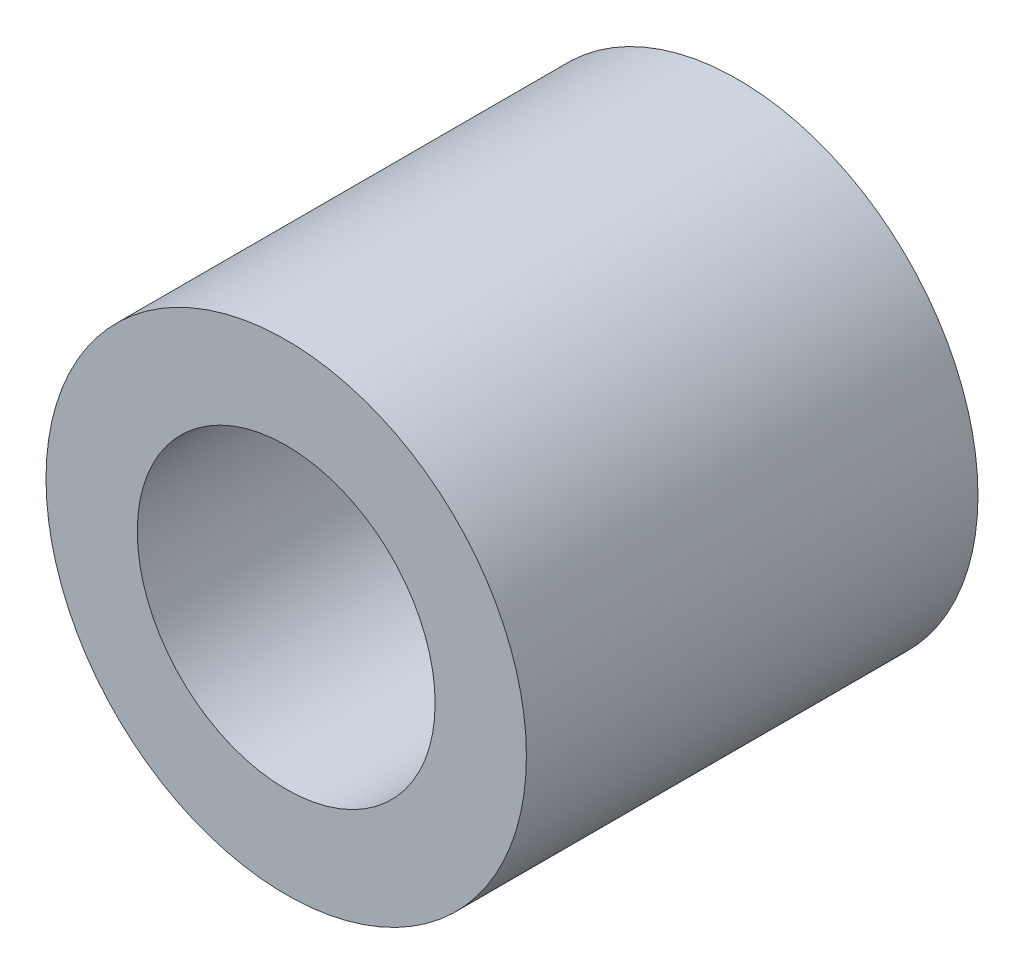
ISO-10303-21;
HEADER;
FILE_DESCRIPTION(('STEP AP214'),'2;1');
FILE_NAME('part.step','',(''),(''),'','','');
FILE_SCHEMA(('AUTOMOTIVE_DESIGN { 1 0 10303 214 1 1 1 1 }'));
ENDSEC;
DATA;
#1=APPLICATION_CONTEXT('core data for automotive mechanical design processes');
#2=APPLICATION_PROTOCOL_DEFINITION('international standard','automotive_design',2000,#1);
#3=PRODUCT_CONTEXT('',#1,'mechanical');
#4=PRODUCT('Part','Part','',(#3));
#5=PRODUCT_RELATED_PRODUCT_CATEGORY('part','',(#4));
#6=PRODUCT_DEFINITION_FORMATION('','',#4);
#7=PRODUCT_DEFINITION_CONTEXT('part definition',#1,'design');
#8=PRODUCT_DEFINITION('design','',#6,#7);
#9=PRODUCT_DEFINITION_SHAPE('','',#8);
#10=(LENGTH_UNIT() NAMED_UNIT(*) SI_UNIT(.MILLI.,.METRE.));
#11=(NAMED_UNIT(*) PLANE_ANGLE_UNIT() SI_UNIT($,.RADIAN.));
#12=(NAMED_UNIT(*) SI_UNIT($,.STERADIAN.) SOLID_ANGLE_UNIT());
#13=UNCERTAINTY_MEASURE_WITH_UNIT(LENGTH_MEASURE(1.E-05),#10,'distance_accuracy_value','');
#14=(GEOMETRIC_REPRESENTATION_CONTEXT(3) GLOBAL_UNCERTAINTY_ASSIGNED_CONTEXT((#13)) GLOBAL_UNIT_ASSIGNED_CONTEXT((#10,
#11,#12)) REPRESENTATION_CONTEXT('',''));
#15=CARTESIAN_POINT('',(0.,0.,0.));
#16=DIRECTION('',(0.,0.,1.));
#17=DIRECTION('',(1.,0.,0.));
#18=AXIS2_PLACEMENT_3D('',#15,#16,#17);
#19=CARTESIAN_POINT('',(0.,0.,4.7));
#20=DIRECTION('',(0.,0.,1.));
#21=DIRECTION('',(1.,0.,0.));
#22=AXIS2_PLACEMENT_3D('',#19,#20,#21);
#23=PLANE('',#22);
#24=CARTESIAN_POINT('',(0.,0.,4.7));
#25=DIRECTION('',(0.,0.,1.));
#26=DIRECTION('',(1.,0.,0.));
#27=AXIS2_PLACEMENT_3D('',#24,#25,#26);
#28=CIRCLE('',#27,2.5);
#29=CARTESIAN_POINT('',(2.5,0.,4.7));
#30=VERTEX_POINT('',#29);
#31=EDGE_CURVE('E10',#30,#30,#28,.T.);
#32=ORIENTED_EDGE('',*,*,#31,.T.);
#33=EDGE_LOOP('',(#32));
#34=FACE_BOUND('',#33,.T.);
#35=CARTESIAN_POINT('',(0.,0.,4.7));
#36=DIRECTION('',(0.,0.,1.));
#37=DIRECTION('',(1.,0.,0.));
#38=AXIS2_PLACEMENT_3D('',#35,#36,#37);
#39=CIRCLE('',#38,1.55);
#40=CARTESIAN_POINT('',(1.55,0.,4.7));
#41=VERTEX_POINT('',#40);
#42=EDGE_CURVE('E44',#41,#41,#39,.T.);
#43=ORIENTED_EDGE('',*,*,#42,.F.);
#44=EDGE_LOOP('',(#43));
#45=FACE_BOUND('',#44,.T.);
#46=ADVANCED_FACE('F33',(#34,#45),#23,.T.);
#47=CARTESIAN_POINT('',(0.,0.,0.));
#48=DIRECTION('',(0.,0.,1.));
#49=DIRECTION('',(1.,0.,0.));
#50=AXIS2_PLACEMENT_3D('',#47,#48,#49);
#51=PLANE('',#50);
#52=CARTESIAN_POINT('',(0.,0.,0.));
#53=DIRECTION('',(0.,0.,1.));
#54=DIRECTION('',(1.,0.,0.));
#55=AXIS2_PLACEMENT_3D('',#52,#53,#54);
#56=CIRCLE('',#55,2.5);
#57=CARTESIAN_POINT('',(2.5,0.,0.));
#58=VERTEX_POINT('',#57);
#59=EDGE_CURVE('E37',#58,#58,#56,.T.);
#60=ORIENTED_EDGE('',*,*,#59,.F.);
#61=EDGE_LOOP('',(#60));
#62=FACE_BOUND('',#61,.T.);
#63=CARTESIAN_POINT('',(0.,0.,0.));
#64=DIRECTION('',(0.,0.,1.));
#65=DIRECTION('',(1.,0.,0.));
#66=AXIS2_PLACEMENT_3D('',#63,#64,#65);
#67=CIRCLE('',#66,1.55);
#68=CARTESIAN_POINT('',(1.55,0.,0.));
#69=VERTEX_POINT('',#68);
#70=EDGE_CURVE('E46',#69,#69,#67,.T.);
#71=ORIENTED_EDGE('',*,*,#70,.T.);
#72=EDGE_LOOP('',(#71));
#73=FACE_BOUND('',#72,.T.);
#74=ADVANCED_FACE('F56',(#62,#73),#51,.F.);
#75=CARTESIAN_POINT('',(0.,0.,4.7));
#76=DIRECTION('',(0.,0.,-1.));
#77=DIRECTION('',(-1.,0.,0.));
#78=AXIS2_PLACEMENT_3D('',#75,#76,#77);
#79=CYLINDRICAL_SURFACE('',#78,2.5);
#80=ORIENTED_EDGE('',*,*,#31,.F.);
#81=EDGE_LOOP('',(#80));
#82=FACE_BOUND('',#81,.T.);
#83=ORIENTED_EDGE('',*,*,#59,.T.);
#84=EDGE_LOOP('',(#83));
#85=FACE_BOUND('',#84,.T.);
#86=ADVANCED_FACE('F35',(#82,#85),#79,.T.);
#87=CARTESIAN_POINT('',(0.,0.,4.7));
#88=DIRECTION('',(0.,0.,-1.));
#89=DIRECTION('',(-1.,0.,0.));
#90=AXIS2_PLACEMENT_3D('',#87,#88,#89);
#91=CYLINDRICAL_SURFACE('',#90,1.55);
#92=ORIENTED_EDGE('',*,*,#42,.T.);
#93=EDGE_LOOP('',(#92));
#94=FACE_BOUND('',#93,.T.);
#95=ORIENTED_EDGE('',*,*,#70,.F.);
#96=EDGE_LOOP('',(#95));
#97=FACE_BOUND('',#96,.T.);
#98=ADVANCED_FACE('F52',(#94,#97),#91,.F.);
#99=CLOSED_SHELL('',(#46,#74,#86,#98));
#100=MANIFOLD_SOLID_BREP('B2',#99);
#101=ADVANCED_BREP_SHAPE_REPRESENTATION('',(#18,#100),#14);
#102=SHAPE_DEFINITION_REPRESENTATION(#9,#101);
ENDSEC;
END-ISO-10303-21;
